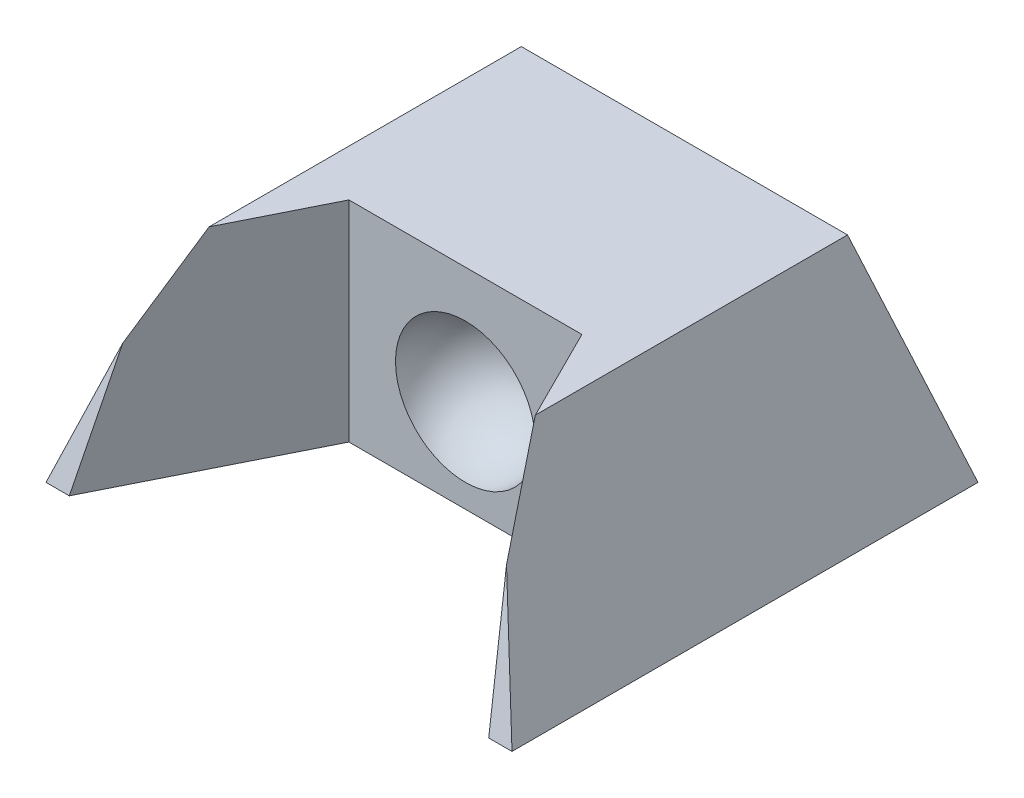
ISO-10303-21;
HEADER;
FILE_DESCRIPTION(('STEP AP214'),'2;1');
FILE_NAME('part.step','',(''),(''),'','','');
FILE_SCHEMA(('AUTOMOTIVE_DESIGN { 1 0 10303 214 1 1 1 1 }'));
ENDSEC;
DATA;
#1=APPLICATION_CONTEXT('core data for automotive mechanical design processes');
#2=APPLICATION_PROTOCOL_DEFINITION('international standard','automotive_design',2000,#1);
#3=PRODUCT_CONTEXT('',#1,'mechanical');
#4=PRODUCT('Part','Part','',(#3));
#5=PRODUCT_RELATED_PRODUCT_CATEGORY('part','',(#4));
#6=PRODUCT_DEFINITION_FORMATION('','',#4);
#7=PRODUCT_DEFINITION_CONTEXT('part definition',#1,'design');
#8=PRODUCT_DEFINITION('design','',#6,#7);
#9=PRODUCT_DEFINITION_SHAPE('','',#8);
#10=(LENGTH_UNIT() NAMED_UNIT(*) SI_UNIT(.MILLI.,.METRE.));
#11=(NAMED_UNIT(*) PLANE_ANGLE_UNIT() SI_UNIT($,.RADIAN.));
#12=(NAMED_UNIT(*) SI_UNIT($,.STERADIAN.) SOLID_ANGLE_UNIT());
#13=UNCERTAINTY_MEASURE_WITH_UNIT(LENGTH_MEASURE(1.E-05),#10,'distance_accuracy_value','');
#14=(GEOMETRIC_REPRESENTATION_CONTEXT(3) GLOBAL_UNCERTAINTY_ASSIGNED_CONTEXT((#13)) GLOBAL_UNIT_ASSIGNED_CONTEXT((#10,
#11,#12)) REPRESENTATION_CONTEXT('',''));
#15=CARTESIAN_POINT('',(0.,0.,0.));
#16=DIRECTION('',(0.,0.,1.));
#17=DIRECTION('',(1.,0.,0.));
#18=AXIS2_PLACEMENT_3D('',#15,#16,#17);
#19=CARTESIAN_POINT('',(0.,0.,-100.));
#20=DIRECTION('',(0.,-1.,0.));
#21=DIRECTION('',(0.,0.,-1.));
#22=AXIS2_PLACEMENT_3D('',#19,#20,#21);
#23=PLANE('',#22);
#24=DIRECTION('',(0.447213595499958,0.,-0.894427190999916));
#25=VECTOR('',#24,1.);
#26=CARTESIAN_POINT('',(25.,0.,-40.));
#27=LINE('',#26,#25);
#28=CARTESIAN_POINT('',(5.,0.,0.));
#29=VERTEX_POINT('',#28);
#30=CARTESIAN_POINT('',(25.,0.,-40.));
#31=VERTEX_POINT('',#30);
#32=EDGE_CURVE('E227',#29,#31,#27,.T.);
#33=ORIENTED_EDGE('',*,*,#32,.F.);
#34=DIRECTION('',(1.,0.,0.));
#35=VECTOR('',#34,1.);
#36=CARTESIAN_POINT('',(0.,0.,0.));
#37=LINE('',#36,#35);
#38=CARTESIAN_POINT('',(0.,0.,0.));
#39=VERTEX_POINT('',#38);
#40=EDGE_CURVE('E270',#39,#29,#37,.T.);
#41=ORIENTED_EDGE('',*,*,#40,.F.);
#42=DIRECTION('',(0.,0.,1.));
#43=VECTOR('',#42,1.);
#44=CARTESIAN_POINT('',(0.,0.,-100.));
#45=LINE('',#44,#43);
#46=CARTESIAN_POINT('',(0.,0.,-100.));
#47=VERTEX_POINT('',#46);
#48=EDGE_CURVE('E269',#47,#39,#45,.T.);
#49=ORIENTED_EDGE('',*,*,#48,.F.);
#50=DIRECTION('',(1.,0.,0.));
#51=VECTOR('',#50,1.);
#52=CARTESIAN_POINT('',(0.,0.,-100.));
#53=LINE('',#52,#51);
#54=CARTESIAN_POINT('',(100.,0.,-100.));
#55=VERTEX_POINT('',#54);
#56=EDGE_CURVE('E266',#47,#55,#53,.T.);
#57=ORIENTED_EDGE('',*,*,#56,.T.);
#58=DIRECTION('',(0.,0.,1.));
#59=VECTOR('',#58,1.);
#60=CARTESIAN_POINT('',(100.,0.,-100.));
#61=LINE('',#60,#59);
#62=CARTESIAN_POINT('',(100.,0.,0.));
#63=VERTEX_POINT('',#62);
#64=EDGE_CURVE('E279',#55,#63,#61,.T.);
#65=ORIENTED_EDGE('',*,*,#64,.T.);
#66=CARTESIAN_POINT('',(95.,0.,0.));
#67=VERTEX_POINT('',#66);
#68=EDGE_CURVE('E265',#67,#63,#37,.T.);
#69=ORIENTED_EDGE('',*,*,#68,.F.);
#70=DIRECTION('',(0.447213595499958,0.,0.894427190999916));
#71=VECTOR('',#70,1.);
#72=CARTESIAN_POINT('',(95.,0.,0.));
#73=LINE('',#72,#71);
#74=CARTESIAN_POINT('',(75.,0.,-40.));
#75=VERTEX_POINT('',#74);
#76=EDGE_CURVE('E58',#75,#67,#73,.T.);
#77=ORIENTED_EDGE('',*,*,#76,.F.);
#78=DIRECTION('',(1.,0.,0.));
#79=VECTOR('',#78,1.);
#80=CARTESIAN_POINT('',(75.,0.,-40.));
#81=LINE('',#80,#79);
#82=EDGE_CURVE('E240',#31,#75,#81,.T.);
#83=ORIENTED_EDGE('',*,*,#82,.F.);
#84=EDGE_LOOP('',(#33,#41,#49,#57,#65,#69,#77,#83));
#85=FACE_BOUND('',#84,.T.);
#86=DIRECTION('',(1.,0.,0.));
#87=VECTOR('',#86,1.);
#88=CARTESIAN_POINT('',(0.,0.,-1.82156153334251));
#89=LINE('',#88,#87);
#90=CARTESIAN_POINT('',(1.84466196843156,0.,-1.8215615333425));
#91=VERTEX_POINT('',#90);
#92=CARTESIAN_POINT('',(3.95422128635894,0.,-1.8215615333425));
#93=VERTEX_POINT('',#92);
#94=EDGE_CURVE('E173',#91,#93,#89,.T.);
#95=ORIENTED_EDGE('',*,*,#94,.T.);
#96=DIRECTION('',(0.447213595499958,0.,-0.894427190999916));
#97=VECTOR('',#96,1.);
#98=CARTESIAN_POINT('',(42.4347524157502,0.,-78.7826237921249));
#99=LINE('',#98,#97);
#100=CARTESIAN_POINT('',(23.9184405196877,0.,-41.75));
#101=VERTEX_POINT('',#100);
#102=EDGE_CURVE('E166',#93,#101,#99,.T.);
#103=ORIENTED_EDGE('',*,*,#102,.T.);
#104=DIRECTION('',(1.,0.,0.));
#105=VECTOR('',#104,1.);
#106=CARTESIAN_POINT('',(0.,0.,-41.75));
#107=LINE('',#106,#105);
#108=CARTESIAN_POINT('',(76.0815594803123,0.,-41.75));
#109=VERTEX_POINT('',#108);
#110=EDGE_CURVE('E221',#101,#109,#107,.T.);
#111=ORIENTED_EDGE('',*,*,#110,.T.);
#112=DIRECTION('',(0.447213595499958,0.,0.894427190999916));
#113=VECTOR('',#112,1.);
#114=CARTESIAN_POINT('',(37.5652475842498,0.,-118.782623792125));
#115=LINE('',#114,#113);
#116=CARTESIAN_POINT('',(96.0457787136411,0.,-1.8215615333425));
#117=VERTEX_POINT('',#116);
#118=EDGE_CURVE('E50',#109,#117,#115,.T.);
#119=ORIENTED_EDGE('',*,*,#118,.T.);
#120=DIRECTION('',(1.,0.,0.));
#121=VECTOR('',#120,1.);
#122=CARTESIAN_POINT('',(0.,0.,-1.82156153334251));
#123=LINE('',#122,#121);
#124=CARTESIAN_POINT('',(98.1553380315684,0.,-1.8215615333425));
#125=VERTEX_POINT('',#124);
#126=EDGE_CURVE('E187',#117,#125,#123,.T.);
#127=ORIENTED_EDGE('',*,*,#126,.T.);
#128=DIRECTION('',(0.,0.,1.));
#129=VECTOR('',#128,1.);
#130=CARTESIAN_POINT('',(98.1553380315685,0.,-100.));
#131=LINE('',#130,#129);
#132=CARTESIAN_POINT('',(98.1553380315684,0.,-98.1784384666575));
#133=VERTEX_POINT('',#132);
#134=EDGE_CURVE('E198',#133,#125,#131,.T.);
#135=ORIENTED_EDGE('',*,*,#134,.F.);
#136=DIRECTION('',(1.,0.,0.));
#137=VECTOR('',#136,1.);
#138=CARTESIAN_POINT('',(0.,0.,-98.1784384666575));
#139=LINE('',#138,#137);
#140=CARTESIAN_POINT('',(1.84466196843156,0.,-98.1784384666575));
#141=VERTEX_POINT('',#140);
#142=EDGE_CURVE('E211',#141,#133,#139,.T.);
#143=ORIENTED_EDGE('',*,*,#142,.F.);
#144=DIRECTION('',(0.,0.,1.));
#145=VECTOR('',#144,1.);
#146=CARTESIAN_POINT('',(1.84466196843156,0.,-100.));
#147=LINE('',#146,#145);
#148=EDGE_CURVE('E212',#141,#91,#147,.T.);
#149=ORIENTED_EDGE('',*,*,#148,.T.);
#150=EDGE_LOOP('',(#95,#103,#111,#119,#127,#135,#143,#149));
#151=FACE_BOUND('',#150,.T.);
#152=ADVANCED_FACE('F35',(#85,#151),#23,.T.);
#153=CARTESIAN_POINT('',(100.,0.,0.));
#154=DIRECTION('',(0.,-0.277539652820775,-0.960714182841143));
#155=DIRECTION('',(0.,0.960714182841143,-0.277539652820775));
#156=AXIS2_PLACEMENT_3D('',#153,#154,#155);
#157=PLANE('',#156);
#158=ORIENTED_EDGE('',*,*,#40,.T.);
#159=DIRECTION('',(0.137452669835625,0.951595406554326,-0.27490533967125));
#160=VECTOR('',#159,1.);
#161=CARTESIAN_POINT('',(6.79485746226943,12.4259362772499,-3.58971492453885));
#162=LINE('',#161,#160);
#163=CARTESIAN_POINT('',(8.8235294117648,26.4705882352945,-7.64705882352953));
#164=VERTEX_POINT('',#163);
#165=EDGE_CURVE('E11',#29,#164,#162,.T.);
#166=ORIENTED_EDGE('',*,*,#165,.T.);
#167=DIRECTION('',(-0.304981379760842,-0.914944139282525,0.26431719579273));
#168=VECTOR('',#167,1.);
#169=CARTESIAN_POINT('',(22.0132286068623,66.039685820587,-19.0781314592807));
#170=LINE('',#169,#168);
#171=EDGE_CURVE('E254',#164,#39,#170,.T.);
#172=ORIENTED_EDGE('',*,*,#171,.T.);
#173=EDGE_LOOP('',(#158,#166,#172));
#174=FACE_BOUND('',#173,.T.);
#175=ADVANCED_FACE('F307',(#174),#157,.F.);
#176=CARTESIAN_POINT('',(15.,45.,-100.));
#177=DIRECTION('',(-0.948683298050514,0.316227766016838,0.));
#178=DIRECTION('',(-0.316227766016838,-0.948683298050514,0.));
#179=AXIS2_PLACEMENT_3D('',#176,#177,#178);
#180=PLANE('',#179);
#181=DIRECTION('',(-0.267261241912424,-0.801783725737273,0.534522483824849));
#182=VECTOR('',#181,1.);
#183=CARTESIAN_POINT('',(26.4285714285714,79.2857142857143,-42.8571428571428));
#184=LINE('',#183,#182);
#185=CARTESIAN_POINT('',(15.,45.,-20.));
#186=VERTEX_POINT('',#185);
#187=EDGE_CURVE('E249',#186,#164,#184,.T.);
#188=ORIENTED_EDGE('',*,*,#187,.F.);
#189=DIRECTION('',(0.,0.,1.));
#190=VECTOR('',#189,1.);
#191=CARTESIAN_POINT('',(15.,45.,-100.));
#192=LINE('',#191,#190);
#193=CARTESIAN_POINT('',(15.,45.,-87.));
#194=VERTEX_POINT('',#193);
#195=EDGE_CURVE('E273',#194,#186,#192,.T.);
#196=ORIENTED_EDGE('',*,*,#195,.F.);
#197=DIRECTION('',(-0.304981379760842,-0.914944139282525,-0.26431719579273));
#198=VECTOR('',#197,1.);
#199=CARTESIAN_POINT('',(13.952046300124,41.856138900372,-87.9082265398925));
#200=LINE('',#199,#198);
#201=EDGE_CURVE('E262',#194,#47,#200,.T.);
#202=ORIENTED_EDGE('',*,*,#201,.T.);
#203=ORIENTED_EDGE('',*,*,#48,.T.);
#204=ORIENTED_EDGE('',*,*,#171,.F.);
#205=EDGE_LOOP('',(#188,#196,#202,#203,#204));
#206=FACE_BOUND('',#205,.T.);
#207=ADVANCED_FACE('F37',(#206),#180,.T.);
#208=CARTESIAN_POINT('',(85.,45.,-100.));
#209=DIRECTION('',(0.,1.,0.));
#210=DIRECTION('',(-1.,0.,0.));
#211=AXIS2_PLACEMENT_3D('',#208,#209,#210);
#212=PLANE('',#211);
#213=DIRECTION('',(0.447213595499958,0.,-0.894427190999916));
#214=VECTOR('',#213,1.);
#215=CARTESIAN_POINT('',(25.,45.,-40.));
#216=LINE('',#215,#214);
#217=CARTESIAN_POINT('',(25.,45.,-40.));
#218=VERTEX_POINT('',#217);
#219=EDGE_CURVE('E228',#186,#218,#216,.T.);
#220=ORIENTED_EDGE('',*,*,#219,.T.);
#221=DIRECTION('',(1.,0.,0.));
#222=VECTOR('',#221,1.);
#223=CARTESIAN_POINT('',(75.,45.,-40.));
#224=LINE('',#223,#222);
#225=CARTESIAN_POINT('',(75.,45.,-40.));
#226=VERTEX_POINT('',#225);
#227=EDGE_CURVE('E231',#218,#226,#224,.T.);
#228=ORIENTED_EDGE('',*,*,#227,.T.);
#229=DIRECTION('',(0.447213595499958,0.,0.894427190999916));
#230=VECTOR('',#229,1.);
#231=CARTESIAN_POINT('',(95.,45.,0.));
#232=LINE('',#231,#230);
#233=CARTESIAN_POINT('',(85.,45.,-20.0000000000001));
#234=VERTEX_POINT('',#233);
#235=EDGE_CURVE('E234',#226,#234,#232,.T.);
#236=ORIENTED_EDGE('',*,*,#235,.T.);
#237=DIRECTION('',(0.,0.,1.));
#238=VECTOR('',#237,1.);
#239=CARTESIAN_POINT('',(85.,45.,-100.));
#240=LINE('',#239,#238);
#241=CARTESIAN_POINT('',(85.,45.,-87.));
#242=VERTEX_POINT('',#241);
#243=EDGE_CURVE('E276',#242,#234,#240,.T.);
#244=ORIENTED_EDGE('',*,*,#243,.F.);
#245=DIRECTION('',(-1.,0.,0.));
#246=VECTOR('',#245,1.);
#247=CARTESIAN_POINT('',(100.,45.,-87.));
#248=LINE('',#247,#246);
#249=EDGE_CURVE('E256',#242,#194,#248,.T.);
#250=ORIENTED_EDGE('',*,*,#249,.T.);
#251=ORIENTED_EDGE('',*,*,#195,.T.);
#252=EDGE_LOOP('',(#220,#228,#236,#244,#250,#251));
#253=FACE_BOUND('',#252,.T.);
#254=ADVANCED_FACE('F300',(#253),#212,.T.);
#255=CARTESIAN_POINT('',(100.,0.,-100.));
#256=DIRECTION('',(0.948683298050514,0.316227766016838,0.));
#257=DIRECTION('',(-0.316227766016838,0.948683298050514,0.));
#258=AXIS2_PLACEMENT_3D('',#255,#256,#257);
#259=PLANE('',#258);
#260=DIRECTION('',(-0.267261241912425,0.801783725737273,-0.534522483824849));
#261=VECTOR('',#260,1.);
#262=CARTESIAN_POINT('',(84.2857142857143,47.1428571428571,-21.4285714285714));
#263=LINE('',#262,#261);
#264=CARTESIAN_POINT('',(91.1764705882353,26.470588235294,-7.64705882352939));
#265=VERTEX_POINT('',#264);
#266=EDGE_CURVE('E246',#265,#234,#263,.T.);
#267=ORIENTED_EDGE('',*,*,#266,.F.);
#268=DIRECTION('',(-0.304981379760842,0.914944139282525,-0.26431719579273));
#269=VECTOR('',#268,1.);
#270=CARTESIAN_POINT('',(91.9388176932617,24.183546920215,-6.98635799917322));
#271=LINE('',#270,#269);
#272=EDGE_CURVE('E251',#63,#265,#271,.T.);
#273=ORIENTED_EDGE('',*,*,#272,.F.);
#274=ORIENTED_EDGE('',*,*,#64,.F.);
#275=DIRECTION('',(-0.304981379760842,0.914944139282525,0.26431719579273));
#276=VECTOR('',#275,1.);
#277=CARTESIAN_POINT('',(100.,0.,-100.));
#278=LINE('',#277,#276);
#279=EDGE_CURVE('E259',#55,#242,#278,.T.);
#280=ORIENTED_EDGE('',*,*,#279,.T.);
#281=ORIENTED_EDGE('',*,*,#243,.T.);
#282=EDGE_LOOP('',(#267,#273,#274,#280,#281));
#283=FACE_BOUND('',#282,.T.);
#284=ADVANCED_FACE('F295',(#283),#259,.T.);
#285=CARTESIAN_POINT('',(100.,0.,-100.));
#286=DIRECTION('',(0.,0.277539652820775,-0.960714182841143));
#287=DIRECTION('',(0.,0.960714182841143,0.277539652820775));
#288=AXIS2_PLACEMENT_3D('',#285,#286,#287);
#289=PLANE('',#288);
#290=ORIENTED_EDGE('',*,*,#249,.F.);
#291=ORIENTED_EDGE('',*,*,#279,.F.);
#292=ORIENTED_EDGE('',*,*,#56,.F.);
#293=ORIENTED_EDGE('',*,*,#201,.F.);
#294=EDGE_LOOP('',(#290,#291,#292,#293));
#295=FACE_BOUND('',#294,.T.);
#296=ADVANCED_FACE('F313',(#295),#289,.T.);
#297=ORIENTED_EDGE('',*,*,#272,.T.);
#298=DIRECTION('',(0.137452669835625,-0.951595406554326,0.27490533967125));
#299=VECTOR('',#298,1.);
#300=CARTESIAN_POINT('',(95.0944661822247,-0.653996646171046,0.188932364449413));
#301=LINE('',#300,#299);
#302=EDGE_CURVE('E43',#265,#67,#301,.T.);
#303=ORIENTED_EDGE('',*,*,#302,.T.);
#304=ORIENTED_EDGE('',*,*,#68,.T.);
#305=EDGE_LOOP('',(#297,#303,#304));
#306=FACE_BOUND('',#305,.T.);
#307=ADVANCED_FACE('F285',(#306),#157,.F.);
#308=CARTESIAN_POINT('',(25.,45.,-40.));
#309=DIRECTION('',(-0.894427190999916,0.,-0.447213595499958));
#310=DIRECTION('',(-0.447213595499958,0.,0.894427190999916));
#311=AXIS2_PLACEMENT_3D('',#308,#309,#310);
#312=PLANE('',#311);
#313=ORIENTED_EDGE('',*,*,#187,.T.);
#314=ORIENTED_EDGE('',*,*,#165,.F.);
#315=ORIENTED_EDGE('',*,*,#32,.T.);
#316=DIRECTION('',(0.,-1.,0.));
#317=VECTOR('',#316,1.);
#318=CARTESIAN_POINT('',(25.,45.,-40.));
#319=LINE('',#318,#317);
#320=EDGE_CURVE('E237',#218,#31,#319,.T.);
#321=ORIENTED_EDGE('',*,*,#320,.F.);
#322=ORIENTED_EDGE('',*,*,#219,.F.);
#323=EDGE_LOOP('',(#313,#314,#315,#321,#322));
#324=FACE_BOUND('',#323,.T.);
#325=ADVANCED_FACE('F320',(#324),#312,.F.);
#326=CARTESIAN_POINT('',(95.,45.,0.));
#327=DIRECTION('',(0.894427190999916,0.,-0.447213595499958));
#328=DIRECTION('',(-0.447213595499958,0.,-0.894427190999916));
#329=AXIS2_PLACEMENT_3D('',#326,#327,#328);
#330=PLANE('',#329);
#331=ORIENTED_EDGE('',*,*,#266,.T.);
#332=ORIENTED_EDGE('',*,*,#235,.F.);
#333=DIRECTION('',(0.,-1.,0.));
#334=VECTOR('',#333,1.);
#335=CARTESIAN_POINT('',(75.,45.,-40.));
#336=LINE('',#335,#334);
#337=EDGE_CURVE('E244',#226,#75,#336,.T.);
#338=ORIENTED_EDGE('',*,*,#337,.T.);
#339=ORIENTED_EDGE('',*,*,#76,.T.);
#340=ORIENTED_EDGE('',*,*,#302,.F.);
#341=EDGE_LOOP('',(#331,#332,#338,#339,#340));
#342=FACE_BOUND('',#341,.T.);
#343=ADVANCED_FACE('F298',(#342),#330,.F.);
#344=CARTESIAN_POINT('',(75.,45.,-40.));
#345=DIRECTION('',(0.,0.,-1.));
#346=DIRECTION('',(-1.,0.,0.));
#347=AXIS2_PLACEMENT_3D('',#344,#345,#346);
#348=PLANE('',#347);
#349=CARTESIAN_POINT('',(50.,20.,-40.));
#350=DIRECTION('',(0.,0.,-1.));
#351=DIRECTION('',(-1.,0.,0.));
#352=AXIS2_PLACEMENT_3D('',#349,#350,#351);
#353=CIRCLE('',#352,15.);
#354=CARTESIAN_POINT('',(35.,20.,-40.));
#355=VERTEX_POINT('',#354);
#356=EDGE_CURVE('E169',#355,#355,#353,.T.);
#357=ORIENTED_EDGE('',*,*,#356,.T.);
#358=EDGE_LOOP('',(#357));
#359=FACE_BOUND('',#358,.T.);
#360=ORIENTED_EDGE('',*,*,#82,.T.);
#361=ORIENTED_EDGE('',*,*,#337,.F.);
#362=ORIENTED_EDGE('',*,*,#227,.F.);
#363=ORIENTED_EDGE('',*,*,#320,.T.);
#364=EDGE_LOOP('',(#360,#361,#362,#363));
#365=FACE_BOUND('',#364,.T.);
#366=ADVANCED_FACE('F303',(#359,#365),#348,.F.);
#367=CARTESIAN_POINT('',(50.,20.,-40.));
#368=DIRECTION('',(0.,0.,-1.));
#369=DIRECTION('',(0.,1.,0.));
#370=AXIS2_PLACEMENT_3D('',#367,#368,#369);
#371=SPHERICAL_SURFACE('',#370,15.);
#372=ORIENTED_EDGE('',*,*,#356,.F.);
#373=EDGE_LOOP('',(#372));
#374=FACE_BOUND('',#373,.T.);
#375=ADVANCED_FACE('F388',(#374),#371,.F.);
#376=CARTESIAN_POINT('',(100.,-0.485694392436355,-1.681249819972));
#377=DIRECTION('',(0.,-0.277539652820775,-0.960714182841143));
#378=DIRECTION('',(0.,0.960714182841143,-0.277539652820775));
#379=AXIS2_PLACEMENT_3D('',#376,#377,#378);
#380=PLANE('',#379);
#381=ORIENTED_EDGE('',*,*,#94,.F.);
#382=DIRECTION('',(-0.304981379760842,-0.914944139282525,0.26431719579273));
#383=VECTOR('',#382,1.);
#384=CARTESIAN_POINT('',(23.5394724513175,65.0844314486578,-20.6237306185103));
#385=LINE('',#384,#383);
#386=CARTESIAN_POINT('',(5.56741370595046,11.1682552125567,-5.04794637252556));
#387=VERTEX_POINT('',#386);
#388=EDGE_CURVE('E153',#387,#91,#385,.T.);
#389=ORIENTED_EDGE('',*,*,#388,.F.);
#390=DIRECTION('',(0.137452669835625,0.951595406554326,-0.27490533967125));
#391=VECTOR('',#390,1.);
#392=CARTESIAN_POINT('',(5.70000650763737,12.0862053780815,-5.31313197589937));
#393=LINE('',#392,#391);
#394=EDGE_CURVE('E163',#93,#387,#393,.T.);
#395=ORIENTED_EDGE('',*,*,#394,.F.);
#396=EDGE_LOOP('',(#381,#389,#395));
#397=FACE_BOUND('',#396,.T.);
#398=ADVANCED_FACE('F172',(#397),#380,.T.);
#399=CARTESIAN_POINT('',(16.6601957715884,44.4466014094705,-100.));
#400=DIRECTION('',(-0.948683298050514,0.316227766016838,0.));
#401=DIRECTION('',(-0.316227766016838,-0.948683298050514,0.));
#402=AXIS2_PLACEMENT_3D('',#399,#400,#401);
#403=PLANE('',#402);
#404=DIRECTION('',(-0.267261241912424,-0.801783725737273,0.534522483824849));
#405=VECTOR('',#404,1.);
#406=CARTESIAN_POINT('',(27.0554085567596,75.6322397649842,-48.0239360741438));
#407=LINE('',#406,#405);
#408=CARTESIAN_POINT('',(16.2613286350982,43.25,-26.4357762308211));
#409=VERTEX_POINT('',#408);
#410=EDGE_CURVE('E148',#409,#387,#407,.T.);
#411=ORIENTED_EDGE('',*,*,#410,.T.);
#412=ORIENTED_EDGE('',*,*,#388,.T.);
#413=ORIENTED_EDGE('',*,*,#148,.F.);
#414=DIRECTION('',(-0.304981379760842,-0.914944139282525,-0.26431719579273));
#415=VECTOR('',#414,1.);
#416=CARTESIAN_POINT('',(15.4782901445792,40.9008845284429,-86.3626273806629));
#417=LINE('',#416,#415);
#418=CARTESIAN_POINT('',(16.2613286350982,43.25,-85.6839940222131));
#419=VERTEX_POINT('',#418);
#420=EDGE_CURVE('E185',#419,#141,#417,.T.);
#421=ORIENTED_EDGE('',*,*,#420,.F.);
#422=DIRECTION('',(0.,0.,1.));
#423=VECTOR('',#422,1.);
#424=CARTESIAN_POINT('',(16.2613286350982,43.25,-100.));
#425=LINE('',#424,#423);
#426=EDGE_CURVE('E156',#419,#409,#425,.T.);
#427=ORIENTED_EDGE('',*,*,#426,.T.);
#428=EDGE_LOOP('',(#411,#412,#413,#421,#427));
#429=FACE_BOUND('',#428,.T.);
#430=ADVANCED_FACE('F150',(#429),#403,.F.);
#431=CARTESIAN_POINT('',(85.,43.25,-100.));
#432=DIRECTION('',(0.,1.,0.));
#433=DIRECTION('',(-1.,0.,0.));
#434=AXIS2_PLACEMENT_3D('',#431,#432,#433);
#435=PLANE('',#434);
#436=DIRECTION('',(0.447213595499958,0.,-0.894427190999916));
#437=VECTOR('',#436,1.);
#438=CARTESIAN_POINT('',(23.4347524157501,43.25,-40.7826237921249));
#439=LINE('',#438,#437);
#440=CARTESIAN_POINT('',(23.9184405196877,43.25,-41.75));
#441=VERTEX_POINT('',#440);
#442=EDGE_CURVE('E188',#409,#441,#439,.T.);
#443=ORIENTED_EDGE('',*,*,#442,.F.);
#444=ORIENTED_EDGE('',*,*,#426,.F.);
#445=DIRECTION('',(-1.,0.,0.));
#446=VECTOR('',#445,1.);
#447=CARTESIAN_POINT('',(85.,43.25,-85.6839940222131));
#448=LINE('',#447,#446);
#449=CARTESIAN_POINT('',(83.7386713649018,43.25,-85.6839940222131));
#450=VERTEX_POINT('',#449);
#451=EDGE_CURVE('E175',#450,#419,#448,.T.);
#452=ORIENTED_EDGE('',*,*,#451,.F.);
#453=DIRECTION('',(0.,0.,1.));
#454=VECTOR('',#453,1.);
#455=CARTESIAN_POINT('',(83.7386713649018,43.25,-100.));
#456=LINE('',#455,#454);
#457=CARTESIAN_POINT('',(83.7386713649018,43.25,-26.4357762308211));
#458=VERTEX_POINT('',#457);
#459=EDGE_CURVE('E184',#450,#458,#456,.T.);
#460=ORIENTED_EDGE('',*,*,#459,.T.);
#461=DIRECTION('',(0.447213595499958,0.,0.894427190999916));
#462=VECTOR('',#461,1.);
#463=CARTESIAN_POINT('',(96.5652475842498,43.25,-0.782623792124927));
#464=LINE('',#463,#462);
#465=CARTESIAN_POINT('',(76.0815594803123,43.25,-41.75));
#466=VERTEX_POINT('',#465);
#467=EDGE_CURVE('E193',#466,#458,#464,.T.);
#468=ORIENTED_EDGE('',*,*,#467,.F.);
#469=DIRECTION('',(1.,0.,0.));
#470=VECTOR('',#469,1.);
#471=CARTESIAN_POINT('',(75.,43.25,-41.75));
#472=LINE('',#471,#470);
#473=EDGE_CURVE('E190',#441,#466,#472,.T.);
#474=ORIENTED_EDGE('',*,*,#473,.F.);
#475=EDGE_LOOP('',(#443,#444,#452,#460,#468,#474));
#476=FACE_BOUND('',#475,.T.);
#477=ADVANCED_FACE('F423',(#476),#435,.F.);
#478=CARTESIAN_POINT('',(98.3398042284116,-0.553398590529467,-100.));
#479=DIRECTION('',(0.948683298050514,0.316227766016838,0.));
#480=DIRECTION('',(-0.316227766016838,0.948683298050514,0.));
#481=AXIS2_PLACEMENT_3D('',#478,#479,#480);
#482=PLANE('',#481);
#483=DIRECTION('',(-0.267261241912425,0.801783725737273,-0.534522483824849));
#484=VECTOR('',#483,1.);
#485=CARTESIAN_POINT('',(83.6588771575261,43.4893826221271,-26.5953646455725));
#486=LINE('',#485,#484);
#487=CARTESIAN_POINT('',(94.4325862940495,11.1682552125568,-5.04794637252557));
#488=VERTEX_POINT('',#487);
#489=EDGE_CURVE('E160',#488,#458,#486,.T.);
#490=ORIENTED_EDGE('',*,*,#489,.T.);
#491=ORIENTED_EDGE('',*,*,#459,.F.);
#492=DIRECTION('',(-0.304981379760842,0.914944139282525,0.26431719579273));
#493=VECTOR('',#492,1.);
#494=CARTESIAN_POINT('',(98.4737561555448,-0.955254371929172,-98.4544008407704));
#495=LINE('',#494,#493);
#496=EDGE_CURVE('E178',#133,#450,#495,.T.);
#497=ORIENTED_EDGE('',*,*,#496,.F.);
#498=ORIENTED_EDGE('',*,*,#134,.T.);
#499=DIRECTION('',(-0.304981379760842,0.914944139282525,-0.26431719579273));
#500=VECTOR('',#499,1.);
#501=CARTESIAN_POINT('',(90.4125738488065,23.2282925482858,-8.53195715840287));
#502=LINE('',#501,#500);
#503=EDGE_CURVE('E159',#125,#488,#502,.T.);
#504=ORIENTED_EDGE('',*,*,#503,.T.);
#505=EDGE_LOOP('',(#490,#491,#497,#498,#504));
#506=FACE_BOUND('',#505,.T.);
#507=ADVANCED_FACE('F433',(#506),#482,.F.);
#508=CARTESIAN_POINT('',(100.,-0.485694392436355,-98.318750180028));
#509=DIRECTION('',(0.,0.277539652820775,-0.960714182841143));
#510=DIRECTION('',(0.,0.960714182841143,0.277539652820775));
#511=AXIS2_PLACEMENT_3D('',#508,#509,#510);
#512=PLANE('',#511);
#513=ORIENTED_EDGE('',*,*,#451,.T.);
#514=ORIENTED_EDGE('',*,*,#420,.T.);
#515=ORIENTED_EDGE('',*,*,#142,.T.);
#516=ORIENTED_EDGE('',*,*,#496,.T.);
#517=EDGE_LOOP('',(#513,#514,#515,#516));
#518=FACE_BOUND('',#517,.T.);
#519=ADVANCED_FACE('F443',(#518),#512,.F.);
#520=ORIENTED_EDGE('',*,*,#503,.F.);
#521=ORIENTED_EDGE('',*,*,#126,.F.);
#522=DIRECTION('',(0.137452669835625,-0.951595406554326,0.27490533967125));
#523=VECTOR('',#522,1.);
#524=CARTESIAN_POINT('',(96.1893171368568,-0.993727545339455,-1.5344846869111));
#525=LINE('',#524,#523);
#526=EDGE_CURVE('E170',#488,#117,#525,.T.);
#527=ORIENTED_EDGE('',*,*,#526,.F.);
#528=EDGE_LOOP('',(#520,#521,#527));
#529=FACE_BOUND('',#528,.T.);
#530=ADVANCED_FACE('F415',(#529),#380,.T.);
#531=CARTESIAN_POINT('',(23.4347524157501,45.,-40.7826237921249));
#532=DIRECTION('',(-0.894427190999916,0.,-0.447213595499958));
#533=DIRECTION('',(-0.447213595499958,0.,0.894427190999916));
#534=AXIS2_PLACEMENT_3D('',#531,#532,#533);
#535=PLANE('',#534);
#536=ORIENTED_EDGE('',*,*,#410,.F.);
#537=ORIENTED_EDGE('',*,*,#442,.T.);
#538=DIRECTION('',(0.,-1.,0.));
#539=VECTOR('',#538,1.);
#540=CARTESIAN_POINT('',(23.9184405196877,45.,-41.75));
#541=LINE('',#540,#539);
#542=EDGE_CURVE('E196',#441,#101,#541,.T.);
#543=ORIENTED_EDGE('',*,*,#542,.T.);
#544=ORIENTED_EDGE('',*,*,#102,.F.);
#545=ORIENTED_EDGE('',*,*,#394,.T.);
#546=EDGE_LOOP('',(#536,#537,#543,#544,#545));
#547=FACE_BOUND('',#546,.T.);
#548=ADVANCED_FACE('F164',(#547),#535,.T.);
#549=CARTESIAN_POINT('',(96.5652475842498,45.,-0.782623792124927));
#550=DIRECTION('',(0.894427190999916,0.,-0.447213595499958));
#551=DIRECTION('',(-0.447213595499958,0.,-0.894427190999916));
#552=AXIS2_PLACEMENT_3D('',#549,#550,#551);
#553=PLANE('',#552);
#554=ORIENTED_EDGE('',*,*,#489,.F.);
#555=ORIENTED_EDGE('',*,*,#526,.T.);
#556=ORIENTED_EDGE('',*,*,#118,.F.);
#557=DIRECTION('',(0.,-1.,0.));
#558=VECTOR('',#557,1.);
#559=CARTESIAN_POINT('',(76.0815594803123,45.,-41.75));
#560=LINE('',#559,#558);
#561=EDGE_CURVE('E200',#466,#109,#560,.T.);
#562=ORIENTED_EDGE('',*,*,#561,.F.);
#563=ORIENTED_EDGE('',*,*,#467,.T.);
#564=EDGE_LOOP('',(#554,#555,#556,#562,#563));
#565=FACE_BOUND('',#564,.T.);
#566=ADVANCED_FACE('F470',(#565),#553,.T.);
#567=CARTESIAN_POINT('',(75.,45.,-41.75));
#568=DIRECTION('',(0.,0.,-1.));
#569=DIRECTION('',(-1.,0.,0.));
#570=AXIS2_PLACEMENT_3D('',#567,#568,#569);
#571=PLANE('',#570);
#572=CARTESIAN_POINT('',(50.,20.,-41.75));
#573=DIRECTION('',(0.,0.,-1.));
#574=DIRECTION('',(-1.,0.,0.));
#575=AXIS2_PLACEMENT_3D('',#572,#573,#574);
#576=CIRCLE('',#575,16.6583312489577);
#577=CARTESIAN_POINT('',(33.3416687510423,20.,-41.75));
#578=VERTEX_POINT('',#577);
#579=EDGE_CURVE('E206',#578,#578,#576,.T.);
#580=ORIENTED_EDGE('',*,*,#579,.F.);
#581=EDGE_LOOP('',(#580));
#582=FACE_BOUND('',#581,.T.);
#583=ORIENTED_EDGE('',*,*,#110,.F.);
#584=ORIENTED_EDGE('',*,*,#542,.F.);
#585=ORIENTED_EDGE('',*,*,#473,.T.);
#586=ORIENTED_EDGE('',*,*,#561,.T.);
#587=EDGE_LOOP('',(#583,#584,#585,#586));
#588=FACE_BOUND('',#587,.T.);
#589=ADVANCED_FACE('F479',(#582,#588),#571,.T.);
#590=CARTESIAN_POINT('',(50.,20.,-40.));
#591=DIRECTION('',(0.,0.,-1.));
#592=DIRECTION('',(0.,1.,0.));
#593=AXIS2_PLACEMENT_3D('',#590,#591,#592);
#594=SPHERICAL_SURFACE('',#593,16.75);
#595=ORIENTED_EDGE('',*,*,#579,.T.);
#596=EDGE_LOOP('',(#595));
#597=FACE_BOUND('',#596,.T.);
#598=ADVANCED_FACE('F488',(#597),#594,.T.);
#599=CLOSED_SHELL('',(#152,#175,#207,#254,#284,#296,#307,#325,#343,#366,#375,#398,#430,#477,
#507,#519,#530,#548,#566,#589,#598));
#600=MANIFOLD_SOLID_BREP('B2',#599);
#601=ADVANCED_BREP_SHAPE_REPRESENTATION('',(#18,#600),#14);
#602=SHAPE_DEFINITION_REPRESENTATION(#9,#601);
ENDSEC;
END-ISO-10303-21;
